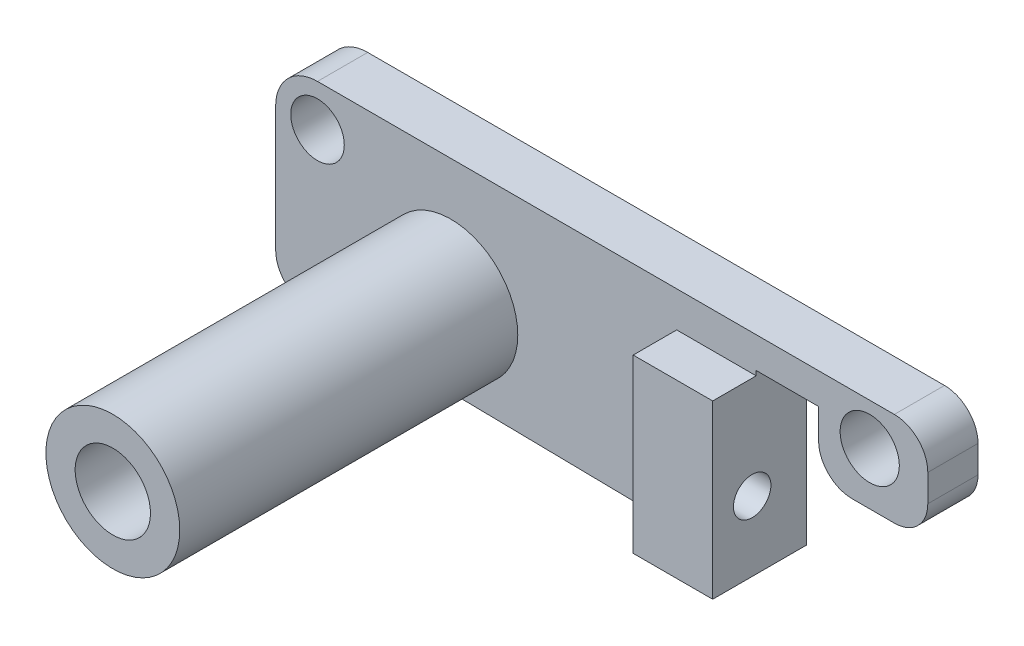
ISO-10303-21;
HEADER;
FILE_DESCRIPTION(('STEP AP214'),'2;1');
FILE_NAME('part.step','',(''),(''),'','','');
FILE_SCHEMA(('AUTOMOTIVE_DESIGN { 1 0 10303 214 1 1 1 1 }'));
ENDSEC;
DATA;
#1=APPLICATION_CONTEXT('core data for automotive mechanical design processes');
#2=APPLICATION_PROTOCOL_DEFINITION('international standard','automotive_design',2000,#1);
#3=PRODUCT_CONTEXT('',#1,'mechanical');
#4=PRODUCT('Part','Part','',(#3));
#5=PRODUCT_RELATED_PRODUCT_CATEGORY('part','',(#4));
#6=PRODUCT_DEFINITION_FORMATION('','',#4);
#7=PRODUCT_DEFINITION_CONTEXT('part definition',#1,'design');
#8=PRODUCT_DEFINITION('design','',#6,#7);
#9=PRODUCT_DEFINITION_SHAPE('','',#8);
#10=(LENGTH_UNIT() NAMED_UNIT(*) SI_UNIT(.MILLI.,.METRE.));
#11=(NAMED_UNIT(*) PLANE_ANGLE_UNIT() SI_UNIT($,.RADIAN.));
#12=(NAMED_UNIT(*) SI_UNIT($,.STERADIAN.) SOLID_ANGLE_UNIT());
#13=UNCERTAINTY_MEASURE_WITH_UNIT(LENGTH_MEASURE(1.E-05),#10,'distance_accuracy_value','');
#14=(GEOMETRIC_REPRESENTATION_CONTEXT(3) GLOBAL_UNCERTAINTY_ASSIGNED_CONTEXT((#13)) GLOBAL_UNIT_ASSIGNED_CONTEXT((#10,
#11,#12)) REPRESENTATION_CONTEXT('',''));
#15=CARTESIAN_POINT('',(0.,0.,0.));
#16=DIRECTION('',(0.,0.,1.));
#17=DIRECTION('',(1.,0.,0.));
#18=AXIS2_PLACEMENT_3D('',#15,#16,#17);
#19=CARTESIAN_POINT('',(0.,0.,3.));
#20=DIRECTION('',(0.,0.,1.));
#21=DIRECTION('',(1.,0.,0.));
#22=AXIS2_PLACEMENT_3D('',#19,#20,#21);
#23=PLANE('',#22);
#24=CARTESIAN_POINT('',(7.9679654286192,-4.64199239961162,3.));
#25=DIRECTION('',(0.,0.,1.));
#26=DIRECTION('',(1.,0.,0.));
#27=AXIS2_PLACEMENT_3D('',#24,#25,#26);
#28=CIRCLE('',#27,4.);
#29=CARTESIAN_POINT('',(11.9679654286192,-4.64199239961162,3.));
#30=VERTEX_POINT('',#29);
#31=EDGE_CURVE('E214',#30,#30,#28,.T.);
#32=ORIENTED_EDGE('',*,*,#31,.F.);
#33=EDGE_LOOP('',(#32));
#34=FACE_BOUND('',#33,.T.);
#35=CARTESIAN_POINT('',(33.,0.,3.));
#36=DIRECTION('',(0.,0.,1.));
#37=DIRECTION('',(1.,0.,0.));
#38=AXIS2_PLACEMENT_3D('',#35,#36,#37);
#39=CIRCLE('',#38,1.76931000502471);
#40=CARTESIAN_POINT('',(34.7693100050247,0.,3.));
#41=VERTEX_POINT('',#40);
#42=EDGE_CURVE('E207',#41,#41,#39,.T.);
#43=ORIENTED_EDGE('',*,*,#42,.F.);
#44=EDGE_LOOP('',(#43));
#45=FACE_BOUND('',#44,.T.);
#46=DIRECTION('',(0.,1.,0.));
#47=VECTOR('',#46,1.);
#48=CARTESIAN_POINT('',(36.4705641379497,2.5,3.));
#49=LINE('',#48,#47);
#50=CARTESIAN_POINT('',(36.4705641379497,-1.1247836523614,3.));
#51=VERTEX_POINT('',#50);
#52=CARTESIAN_POINT('',(36.4705641379497,0.5,3.));
#53=VERTEX_POINT('',#52);
#54=EDGE_CURVE('E296',#51,#53,#49,.T.);
#55=ORIENTED_EDGE('',*,*,#54,.T.);
#56=CARTESIAN_POINT('',(34.4705641379497,0.5,3.));
#57=DIRECTION('',(0.,0.,1.));
#58=DIRECTION('',(1.,0.,0.));
#59=AXIS2_PLACEMENT_3D('',#56,#57,#58);
#60=CIRCLE('',#59,2.);
#61=CARTESIAN_POINT('',(34.4705641379497,2.5,3.));
#62=VERTEX_POINT('',#61);
#63=EDGE_CURVE('E356',#53,#62,#60,.T.);
#64=ORIENTED_EDGE('',*,*,#63,.T.);
#65=DIRECTION('',(-1.,0.,0.));
#66=VECTOR('',#65,1.);
#67=CARTESIAN_POINT('',(0.,2.5,3.));
#68=LINE('',#67,#66);
#69=CARTESIAN_POINT('',(0.,2.5,3.));
#70=VERTEX_POINT('',#69);
#71=EDGE_CURVE('E298',#62,#70,#68,.T.);
#72=ORIENTED_EDGE('',*,*,#71,.T.);
#73=CARTESIAN_POINT('',(0.,0.,3.));
#74=DIRECTION('',(0.,0.,1.));
#75=DIRECTION('',(1.,0.,0.));
#76=AXIS2_PLACEMENT_3D('',#73,#74,#75);
#77=CIRCLE('',#76,2.5);
#78=CARTESIAN_POINT('',(-2.5,0.,3.));
#79=VERTEX_POINT('',#78);
#80=EDGE_CURVE('E278',#70,#79,#77,.T.);
#81=ORIENTED_EDGE('',*,*,#80,.T.);
#82=DIRECTION('',(0.,-1.,0.));
#83=VECTOR('',#82,1.);
#84=CARTESIAN_POINT('',(-2.5,-9.4475342537003,3.));
#85=LINE('',#84,#83);
#86=CARTESIAN_POINT('',(-2.5,-7.4783441678846,3.));
#87=VERTEX_POINT('',#86);
#88=EDGE_CURVE('E281',#79,#87,#85,.T.);
#89=ORIENTED_EDGE('',*,*,#88,.T.);
#90=CARTESIAN_POINT('',(-0.5,-7.4783441678846,3.));
#91=DIRECTION('',(0.,0.,1.));
#92=DIRECTION('',(1.,0.,0.));
#93=AXIS2_PLACEMENT_3D('',#90,#91,#92);
#94=CIRCLE('',#93,2.);
#95=CARTESIAN_POINT('',(-0.531047198291525,-9.47810317123432,3.));
#96=VERTEX_POINT('',#95);
#97=EDGE_CURVE('E48',#87,#96,#94,.T.);
#98=ORIENTED_EDGE('',*,*,#97,.T.);
#99=DIRECTION('',(0.999879501674858,-0.0155235991457657,0.));
#100=VECTOR('',#99,1.);
#101=CARTESIAN_POINT('',(26.2163596370604,-9.89336923199984,3.));
#102=LINE('',#101,#100);
#103=CARTESIAN_POINT('',(21.4651231541347,-9.81960405281162,3.));
#104=VERTEX_POINT('',#103);
#105=EDGE_CURVE('E284',#96,#104,#102,.T.);
#106=ORIENTED_EDGE('',*,*,#105,.T.);
#107=DIRECTION('',(0.,-1.,0.));
#108=VECTOR('',#107,1.);
#109=CARTESIAN_POINT('',(21.4651231541347,-9.89336923199984,3.));
#110=LINE('',#109,#108);
#111=CARTESIAN_POINT('',(21.4651231541347,-6.82152079733287,3.));
#112=VERTEX_POINT('',#111);
#113=EDGE_CURVE('E177',#112,#104,#110,.T.);
#114=ORIENTED_EDGE('',*,*,#113,.F.);
#115=CARTESIAN_POINT('',(21.4651231541347,-4.63670768384501,3.));
#116=VERTEX_POINT('',#115);
#117=EDGE_CURVE('E160',#116,#112,#110,.T.);
#118=ORIENTED_EDGE('',*,*,#117,.F.);
#119=CARTESIAN_POINT('',(21.4651231541347,0.370885759411058,3.));
#120=VERTEX_POINT('',#119);
#121=EDGE_CURVE('E175',#120,#116,#110,.T.);
#122=ORIENTED_EDGE('',*,*,#121,.F.);
#123=DIRECTION('',(-1.,0.,0.));
#124=VECTOR('',#123,1.);
#125=CARTESIAN_POINT('',(26.2163596370604,0.370885759411058,3.));
#126=LINE('',#125,#124);
#127=CARTESIAN_POINT('',(26.2163596370604,0.370885759411058,3.));
#128=VERTEX_POINT('',#127);
#129=EDGE_CURVE('E172',#128,#120,#126,.T.);
#130=ORIENTED_EDGE('',*,*,#129,.F.);
#131=DIRECTION('',(0.,1.,0.));
#132=VECTOR('',#131,1.);
#133=CARTESIAN_POINT('',(26.2163596370604,0.647373354610181,3.));
#134=LINE('',#133,#132);
#135=CARTESIAN_POINT('',(26.2163596370604,0.647373354610181,3.));
#136=VERTEX_POINT('',#135);
#137=EDGE_CURVE('E286',#128,#136,#134,.T.);
#138=ORIENTED_EDGE('',*,*,#137,.T.);
#139=DIRECTION('',(1.,0.,0.));
#140=VECTOR('',#139,1.);
#141=CARTESIAN_POINT('',(29.9451612737474,0.647373354610181,3.));
#142=LINE('',#141,#140);
#143=CARTESIAN_POINT('',(29.9451612737474,0.647373354610181,3.));
#144=VERTEX_POINT('',#143);
#145=EDGE_CURVE('E288',#136,#144,#142,.T.);
#146=ORIENTED_EDGE('',*,*,#145,.T.);
#147=DIRECTION('',(0.,-1.,0.));
#148=VECTOR('',#147,1.);
#149=CARTESIAN_POINT('',(29.9451612737474,-3.1247836523614,3.));
#150=LINE('',#149,#148);
#151=CARTESIAN_POINT('',(29.9451612737474,-1.1247836523614,3.));
#152=VERTEX_POINT('',#151);
#153=EDGE_CURVE('E290',#144,#152,#150,.T.);
#154=ORIENTED_EDGE('',*,*,#153,.T.);
#155=CARTESIAN_POINT('',(31.9451612737474,-1.1247836523614,3.));
#156=DIRECTION('',(0.,0.,1.));
#157=DIRECTION('',(1.,0.,0.));
#158=AXIS2_PLACEMENT_3D('',#155,#156,#157);
#159=CIRCLE('',#158,2.);
#160=CARTESIAN_POINT('',(31.9451612737474,-3.1247836523614,3.));
#161=VERTEX_POINT('',#160);
#162=EDGE_CURVE('E352',#152,#161,#159,.T.);
#163=ORIENTED_EDGE('',*,*,#162,.T.);
#164=DIRECTION('',(1.,0.,0.));
#165=VECTOR('',#164,1.);
#166=CARTESIAN_POINT('',(36.4705641379497,-3.1247836523614,3.));
#167=LINE('',#166,#165);
#168=CARTESIAN_POINT('',(34.4705641379497,-3.1247836523614,3.));
#169=VERTEX_POINT('',#168);
#170=EDGE_CURVE('E293',#161,#169,#167,.T.);
#171=ORIENTED_EDGE('',*,*,#170,.T.);
#172=CARTESIAN_POINT('',(34.4705641379497,-1.1247836523614,3.));
#173=DIRECTION('',(0.,0.,1.));
#174=DIRECTION('',(1.,0.,0.));
#175=AXIS2_PLACEMENT_3D('',#172,#173,#174);
#176=CIRCLE('',#175,2.);
#177=EDGE_CURVE('E354',#169,#51,#176,.T.);
#178=ORIENTED_EDGE('',*,*,#177,.T.);
#179=EDGE_LOOP('',(#55,#64,#72,#81,#89,#98,#106,#114,#118,#122,#130,#138,#146,#154,#163,#171,#178));
#180=FACE_BOUND('',#179,.T.);
#181=CARTESIAN_POINT('',(0.,0.,3.));
#182=DIRECTION('',(0.,0.,1.));
#183=DIRECTION('',(1.,0.,0.));
#184=AXIS2_PLACEMENT_3D('',#181,#182,#183);
#185=CIRCLE('',#184,1.6);
#186=CARTESIAN_POINT('',(1.6,0.,3.));
#187=VERTEX_POINT('',#186);
#188=EDGE_CURVE('E270',#187,#187,#185,.T.);
#189=ORIENTED_EDGE('',*,*,#188,.F.);
#190=EDGE_LOOP('',(#189));
#191=FACE_BOUND('',#190,.T.);
#192=ADVANCED_FACE('F33',(#34,#45,#180,#191),#23,.T.);
#193=CARTESIAN_POINT('',(0.,0.,0.));
#194=DIRECTION('',(0.,0.,1.));
#195=DIRECTION('',(1.,0.,0.));
#196=AXIS2_PLACEMENT_3D('',#193,#194,#195);
#197=PLANE('',#196);
#198=CARTESIAN_POINT('',(33.,0.,0.));
#199=DIRECTION('',(0.,0.,-1.));
#200=DIRECTION('',(-1.,0.,0.));
#201=AXIS2_PLACEMENT_3D('',#198,#199,#200);
#202=CIRCLE('',#201,1.76931000502471);
#203=CARTESIAN_POINT('',(31.2306899949753,0.,0.));
#204=VERTEX_POINT('',#203);
#205=EDGE_CURVE('E210',#204,#204,#202,.T.);
#206=ORIENTED_EDGE('',*,*,#205,.F.);
#207=EDGE_LOOP('',(#206));
#208=FACE_BOUND('',#207,.T.);
#209=DIRECTION('',(-1.,0.,0.));
#210=VECTOR('',#209,1.);
#211=CARTESIAN_POINT('',(0.,2.5,0.));
#212=LINE('',#211,#210);
#213=CARTESIAN_POINT('',(34.4705641379497,2.5,0.));
#214=VERTEX_POINT('',#213);
#215=CARTESIAN_POINT('',(0.,2.5,0.));
#216=VERTEX_POINT('',#215);
#217=EDGE_CURVE('E265',#214,#216,#212,.T.);
#218=ORIENTED_EDGE('',*,*,#217,.F.);
#219=CARTESIAN_POINT('',(34.4705641379497,0.5,0.));
#220=DIRECTION('',(0.,0.,1.));
#221=DIRECTION('',(1.,0.,0.));
#222=AXIS2_PLACEMENT_3D('',#219,#220,#221);
#223=CIRCLE('',#222,2.);
#224=CARTESIAN_POINT('',(36.4705641379497,0.5,0.));
#225=VERTEX_POINT('',#224);
#226=EDGE_CURVE('E344',#214,#225,#223,.F.);
#227=ORIENTED_EDGE('',*,*,#226,.T.);
#228=DIRECTION('',(0.,1.,0.));
#229=VECTOR('',#228,1.);
#230=CARTESIAN_POINT('',(36.4705641379497,2.5,0.));
#231=LINE('',#230,#229);
#232=CARTESIAN_POINT('',(36.4705641379497,-1.1247836523614,0.));
#233=VERTEX_POINT('',#232);
#234=EDGE_CURVE('E317',#233,#225,#231,.T.);
#235=ORIENTED_EDGE('',*,*,#234,.F.);
#236=CARTESIAN_POINT('',(34.4705641379497,-1.1247836523614,0.));
#237=DIRECTION('',(0.,0.,1.));
#238=DIRECTION('',(1.,0.,0.));
#239=AXIS2_PLACEMENT_3D('',#236,#237,#238);
#240=CIRCLE('',#239,2.);
#241=CARTESIAN_POINT('',(34.4705641379497,-3.1247836523614,0.));
#242=VERTEX_POINT('',#241);
#243=EDGE_CURVE('E342',#233,#242,#240,.F.);
#244=ORIENTED_EDGE('',*,*,#243,.T.);
#245=DIRECTION('',(1.,0.,0.));
#246=VECTOR('',#245,1.);
#247=CARTESIAN_POINT('',(36.4705641379497,-3.1247836523614,0.));
#248=LINE('',#247,#246);
#249=CARTESIAN_POINT('',(31.9451612737474,-3.1247836523614,0.));
#250=VERTEX_POINT('',#249);
#251=EDGE_CURVE('E314',#250,#242,#248,.T.);
#252=ORIENTED_EDGE('',*,*,#251,.F.);
#253=CARTESIAN_POINT('',(31.9451612737474,-1.1247836523614,0.));
#254=DIRECTION('',(0.,0.,1.));
#255=DIRECTION('',(1.,0.,0.));
#256=AXIS2_PLACEMENT_3D('',#253,#254,#255);
#257=CIRCLE('',#256,2.);
#258=CARTESIAN_POINT('',(29.9451612737474,-1.1247836523614,0.));
#259=VERTEX_POINT('',#258);
#260=EDGE_CURVE('E340',#250,#259,#257,.F.);
#261=ORIENTED_EDGE('',*,*,#260,.T.);
#262=DIRECTION('',(0.,-1.,0.));
#263=VECTOR('',#262,1.);
#264=CARTESIAN_POINT('',(29.9451612737474,-3.1247836523614,0.));
#265=LINE('',#264,#263);
#266=CARTESIAN_POINT('',(29.9451612737474,0.647373354610181,0.));
#267=VERTEX_POINT('',#266);
#268=EDGE_CURVE('E311',#267,#259,#265,.T.);
#269=ORIENTED_EDGE('',*,*,#268,.F.);
#270=DIRECTION('',(1.,0.,0.));
#271=VECTOR('',#270,1.);
#272=CARTESIAN_POINT('',(29.9451612737474,0.647373354610181,0.));
#273=LINE('',#272,#271);
#274=CARTESIAN_POINT('',(26.2163596370604,0.647373354610181,0.));
#275=VERTEX_POINT('',#274);
#276=EDGE_CURVE('E309',#275,#267,#273,.T.);
#277=ORIENTED_EDGE('',*,*,#276,.F.);
#278=DIRECTION('',(0.,1.,0.));
#279=VECTOR('',#278,1.);
#280=CARTESIAN_POINT('',(26.2163596370604,0.647373354610181,0.));
#281=LINE('',#280,#279);
#282=CARTESIAN_POINT('',(26.2163596370604,-9.89336923199984,0.));
#283=VERTEX_POINT('',#282);
#284=EDGE_CURVE('E307',#283,#275,#281,.T.);
#285=ORIENTED_EDGE('',*,*,#284,.F.);
#286=DIRECTION('',(0.999879501674858,-0.0155235991457657,0.));
#287=VECTOR('',#286,1.);
#288=CARTESIAN_POINT('',(26.2163596370604,-9.89336923199984,0.));
#289=LINE('',#288,#287);
#290=CARTESIAN_POINT('',(-0.531047198291525,-9.47810317123432,0.));
#291=VERTEX_POINT('',#290);
#292=EDGE_CURVE('E305',#291,#283,#289,.T.);
#293=ORIENTED_EDGE('',*,*,#292,.F.);
#294=CARTESIAN_POINT('',(-0.5,-7.4783441678846,0.));
#295=DIRECTION('',(0.,0.,1.));
#296=DIRECTION('',(1.,0.,0.));
#297=AXIS2_PLACEMENT_3D('',#294,#295,#296);
#298=CIRCLE('',#297,2.);
#299=CARTESIAN_POINT('',(-2.5,-7.4783441678846,0.));
#300=VERTEX_POINT('',#299);
#301=EDGE_CURVE('E338',#291,#300,#298,.F.);
#302=ORIENTED_EDGE('',*,*,#301,.T.);
#303=DIRECTION('',(0.,-1.,0.));
#304=VECTOR('',#303,1.);
#305=CARTESIAN_POINT('',(-2.5,-9.4475342537003,0.));
#306=LINE('',#305,#304);
#307=CARTESIAN_POINT('',(-2.5,0.,0.));
#308=VERTEX_POINT('',#307);
#309=EDGE_CURVE('E303',#308,#300,#306,.T.);
#310=ORIENTED_EDGE('',*,*,#309,.F.);
#311=CARTESIAN_POINT('',(0.,0.,0.));
#312=DIRECTION('',(0.,0.,1.));
#313=DIRECTION('',(1.,0.,0.));
#314=AXIS2_PLACEMENT_3D('',#311,#312,#313);
#315=CIRCLE('',#314,2.5);
#316=EDGE_CURVE('E274',#216,#308,#315,.T.);
#317=ORIENTED_EDGE('',*,*,#316,.F.);
#318=EDGE_LOOP('',(#218,#227,#235,#244,#252,#261,#269,#277,#285,#293,#302,#310,#317));
#319=FACE_BOUND('',#318,.T.);
#320=CARTESIAN_POINT('',(0.,0.,0.));
#321=DIRECTION('',(0.,0.,1.));
#322=DIRECTION('',(1.,0.,0.));
#323=AXIS2_PLACEMENT_3D('',#320,#321,#322);
#324=CIRCLE('',#323,1.6);
#325=CARTESIAN_POINT('',(1.6,0.,0.));
#326=VERTEX_POINT('',#325);
#327=EDGE_CURVE('E268',#326,#326,#324,.T.);
#328=ORIENTED_EDGE('',*,*,#327,.T.);
#329=EDGE_LOOP('',(#328));
#330=FACE_BOUND('',#329,.T.);
#331=ADVANCED_FACE('F249',(#208,#319,#330),#197,.F.);
#332=CARTESIAN_POINT('',(0.,0.,3.));
#333=DIRECTION('',(0.,0.,-1.));
#334=DIRECTION('',(-1.,0.,0.));
#335=AXIS2_PLACEMENT_3D('',#332,#333,#334);
#336=CYLINDRICAL_SURFACE('',#335,2.5);
#337=ORIENTED_EDGE('',*,*,#316,.T.);
#338=DIRECTION('',(0.,0.,-1.));
#339=VECTOR('',#338,1.);
#340=CARTESIAN_POINT('',(-2.5,0.,3.));
#341=LINE('',#340,#339);
#342=EDGE_CURVE('E332',#79,#308,#341,.T.);
#343=ORIENTED_EDGE('',*,*,#342,.F.);
#344=ORIENTED_EDGE('',*,*,#80,.F.);
#345=DIRECTION('',(0.,0.,-1.));
#346=VECTOR('',#345,1.);
#347=CARTESIAN_POINT('',(0.,2.5,3.));
#348=LINE('',#347,#346);
#349=EDGE_CURVE('E300',#70,#216,#348,.T.);
#350=ORIENTED_EDGE('',*,*,#349,.T.);
#351=EDGE_LOOP('',(#337,#343,#344,#350));
#352=FACE_BOUND('',#351,.T.);
#353=ADVANCED_FACE('F260',(#352),#336,.T.);
#354=CARTESIAN_POINT('',(-2.5,-9.4475342537003,3.));
#355=DIRECTION('',(1.,0.,0.));
#356=DIRECTION('',(0.,0.,-1.));
#357=AXIS2_PLACEMENT_3D('',#354,#355,#356);
#358=PLANE('',#357);
#359=ORIENTED_EDGE('',*,*,#309,.T.);
#360=DIRECTION('',(0.,0.,-1.));
#361=VECTOR('',#360,1.);
#362=CARTESIAN_POINT('',(-2.5,-7.4783441678846,3.));
#363=LINE('',#362,#361);
#364=EDGE_CURVE('E11',#300,#87,#363,.F.);
#365=ORIENTED_EDGE('',*,*,#364,.T.);
#366=ORIENTED_EDGE('',*,*,#88,.F.);
#367=ORIENTED_EDGE('',*,*,#342,.T.);
#368=EDGE_LOOP('',(#359,#365,#366,#367));
#369=FACE_BOUND('',#368,.T.);
#370=ADVANCED_FACE('F442',(#369),#358,.F.);
#371=CARTESIAN_POINT('',(26.2163596370604,-9.89336923199984,3.));
#372=DIRECTION('',(0.0155235991457657,0.999879501674858,0.));
#373=DIRECTION('',(-0.999879501674858,0.0155235991457657,0.));
#374=AXIS2_PLACEMENT_3D('',#371,#372,#373);
#375=PLANE('',#374);
#376=ORIENTED_EDGE('',*,*,#105,.F.);
#377=DIRECTION('',(0.,0.,-1.));
#378=VECTOR('',#377,1.);
#379=CARTESIAN_POINT('',(-0.531047198291532,-9.47810317123432,3.));
#380=LINE('',#379,#378);
#381=EDGE_CURVE('E41',#96,#291,#380,.T.);
#382=ORIENTED_EDGE('',*,*,#381,.T.);
#383=ORIENTED_EDGE('',*,*,#292,.T.);
#384=DIRECTION('',(0.,0.,-1.));
#385=VECTOR('',#384,1.);
#386=CARTESIAN_POINT('',(26.2163596370604,-9.89336923199984,3.));
#387=LINE('',#386,#385);
#388=CARTESIAN_POINT('',(26.2163596370604,-9.89336923199984,3.));
#389=VERTEX_POINT('',#388);
#390=EDGE_CURVE('E329',#389,#283,#387,.T.);
#391=ORIENTED_EDGE('',*,*,#390,.F.);
#392=EDGE_CURVE('E283',#104,#389,#102,.T.);
#393=ORIENTED_EDGE('',*,*,#392,.F.);
#394=EDGE_LOOP('',(#376,#382,#383,#391,#393));
#395=FACE_BOUND('',#394,.T.);
#396=ADVANCED_FACE('F368',(#395),#375,.F.);
#397=CARTESIAN_POINT('',(26.2163596370604,0.647373354610181,3.));
#398=DIRECTION('',(-1.,0.,0.));
#399=DIRECTION('',(0.,0.,1.));
#400=AXIS2_PLACEMENT_3D('',#397,#398,#399);
#401=PLANE('',#400);
#402=CARTESIAN_POINT('',(26.2163596370604,-5.72911424058894,3.24117304498722));
#403=DIRECTION('',(1.,0.,0.));
#404=DIRECTION('',(0.,0.,-1.));
#405=AXIS2_PLACEMENT_3D('',#402,#403,#404);
#406=CIRCLE('',#405,1.11871199280491);
#407=CARTESIAN_POINT('',(26.2163596370604,-5.72911424058894,2.1224610521823));
#408=VERTEX_POINT('',#407);
#409=EDGE_CURVE('E164',#408,#408,#406,.T.);
#410=ORIENTED_EDGE('',*,*,#409,.F.);
#411=EDGE_LOOP('',(#410));
#412=FACE_BOUND('',#411,.T.);
#413=ORIENTED_EDGE('',*,*,#284,.T.);
#414=DIRECTION('',(0.,0.,-1.));
#415=VECTOR('',#414,1.);
#416=CARTESIAN_POINT('',(26.2163596370604,0.647373354610181,3.));
#417=LINE('',#416,#415);
#418=EDGE_CURVE('E326',#136,#275,#417,.T.);
#419=ORIENTED_EDGE('',*,*,#418,.F.);
#420=ORIENTED_EDGE('',*,*,#137,.F.);
#421=DIRECTION('',(0.,0.,-1.));
#422=VECTOR('',#421,1.);
#423=CARTESIAN_POINT('',(26.2163596370604,0.370885759411058,5.6));
#424=LINE('',#423,#422);
#425=CARTESIAN_POINT('',(26.2163596370604,0.370885759411058,5.6));
#426=VERTEX_POINT('',#425);
#427=EDGE_CURVE('E271',#426,#128,#424,.T.);
#428=ORIENTED_EDGE('',*,*,#427,.F.);
#429=DIRECTION('',(0.,1.,0.));
#430=VECTOR('',#429,1.);
#431=CARTESIAN_POINT('',(26.2163596370604,-9.89336923199984,5.6));
#432=LINE('',#431,#430);
#433=CARTESIAN_POINT('',(26.2163596370604,-9.89336923199984,5.6));
#434=VERTEX_POINT('',#433);
#435=EDGE_CURVE('E187',#434,#426,#432,.T.);
#436=ORIENTED_EDGE('',*,*,#435,.F.);
#437=DIRECTION('',(0.,0.,-1.));
#438=VECTOR('',#437,1.);
#439=CARTESIAN_POINT('',(26.2163596370604,-9.89336923199984,5.6));
#440=LINE('',#439,#438);
#441=EDGE_CURVE('E198',#434,#389,#440,.T.);
#442=ORIENTED_EDGE('',*,*,#441,.T.);
#443=ORIENTED_EDGE('',*,*,#390,.T.);
#444=EDGE_LOOP('',(#413,#419,#420,#428,#436,#442,#443));
#445=FACE_BOUND('',#444,.T.);
#446=ADVANCED_FACE('F376',(#412,#445),#401,.F.);
#447=CARTESIAN_POINT('',(29.9451612737474,0.647373354610181,3.));
#448=DIRECTION('',(0.,1.,0.));
#449=DIRECTION('',(0.,0.,1.));
#450=AXIS2_PLACEMENT_3D('',#447,#448,#449);
#451=PLANE('',#450);
#452=ORIENTED_EDGE('',*,*,#276,.T.);
#453=DIRECTION('',(0.,0.,-1.));
#454=VECTOR('',#453,1.);
#455=CARTESIAN_POINT('',(29.9451612737474,0.647373354610181,3.));
#456=LINE('',#455,#454);
#457=EDGE_CURVE('E323',#144,#267,#456,.T.);
#458=ORIENTED_EDGE('',*,*,#457,.F.);
#459=ORIENTED_EDGE('',*,*,#145,.F.);
#460=ORIENTED_EDGE('',*,*,#418,.T.);
#461=EDGE_LOOP('',(#452,#458,#459,#460));
#462=FACE_BOUND('',#461,.T.);
#463=ADVANCED_FACE('F381',(#462),#451,.F.);
#464=CARTESIAN_POINT('',(29.9451612737474,-3.1247836523614,3.));
#465=DIRECTION('',(1.,0.,0.));
#466=DIRECTION('',(0.,0.,-1.));
#467=AXIS2_PLACEMENT_3D('',#464,#465,#466);
#468=PLANE('',#467);
#469=ORIENTED_EDGE('',*,*,#268,.T.);
#470=DIRECTION('',(0.,0.,-1.));
#471=VECTOR('',#470,1.);
#472=CARTESIAN_POINT('',(29.9451612737474,-1.1247836523614,3.));
#473=LINE('',#472,#471);
#474=EDGE_CURVE('E363',#259,#152,#473,.F.);
#475=ORIENTED_EDGE('',*,*,#474,.T.);
#476=ORIENTED_EDGE('',*,*,#153,.F.);
#477=ORIENTED_EDGE('',*,*,#457,.T.);
#478=EDGE_LOOP('',(#469,#475,#476,#477));
#479=FACE_BOUND('',#478,.T.);
#480=ADVANCED_FACE('F430',(#479),#468,.F.);
#481=CARTESIAN_POINT('',(36.4705641379497,-3.1247836523614,3.));
#482=DIRECTION('',(0.,1.,0.));
#483=DIRECTION('',(0.,0.,1.));
#484=AXIS2_PLACEMENT_3D('',#481,#482,#483);
#485=PLANE('',#484);
#486=ORIENTED_EDGE('',*,*,#251,.T.);
#487=DIRECTION('',(0.,0.,-1.));
#488=VECTOR('',#487,1.);
#489=CARTESIAN_POINT('',(34.4705641379497,-3.1247836523614,3.));
#490=LINE('',#489,#488);
#491=EDGE_CURVE('E361',#242,#169,#490,.F.);
#492=ORIENTED_EDGE('',*,*,#491,.T.);
#493=ORIENTED_EDGE('',*,*,#170,.F.);
#494=DIRECTION('',(0.,0.,-1.));
#495=VECTOR('',#494,1.);
#496=CARTESIAN_POINT('',(31.9451612737474,-3.1247836523614,3.));
#497=LINE('',#496,#495);
#498=EDGE_CURVE('E358',#161,#250,#497,.T.);
#499=ORIENTED_EDGE('',*,*,#498,.T.);
#500=EDGE_LOOP('',(#486,#492,#493,#499));
#501=FACE_BOUND('',#500,.T.);
#502=ADVANCED_FACE('F426',(#501),#485,.F.);
#503=CARTESIAN_POINT('',(36.4705641379497,2.5,3.));
#504=DIRECTION('',(-1.,0.,0.));
#505=DIRECTION('',(0.,0.,1.));
#506=AXIS2_PLACEMENT_3D('',#503,#504,#505);
#507=PLANE('',#506);
#508=ORIENTED_EDGE('',*,*,#234,.T.);
#509=DIRECTION('',(0.,0.,-1.));
#510=VECTOR('',#509,1.);
#511=CARTESIAN_POINT('',(36.4705641379497,0.5,3.));
#512=LINE('',#511,#510);
#513=EDGE_CURVE('E349',#225,#53,#512,.F.);
#514=ORIENTED_EDGE('',*,*,#513,.T.);
#515=ORIENTED_EDGE('',*,*,#54,.F.);
#516=DIRECTION('',(0.,0.,-1.));
#517=VECTOR('',#516,1.);
#518=CARTESIAN_POINT('',(36.4705641379497,-1.1247836523614,3.));
#519=LINE('',#518,#517);
#520=EDGE_CURVE('E346',#51,#233,#519,.T.);
#521=ORIENTED_EDGE('',*,*,#520,.T.);
#522=EDGE_LOOP('',(#508,#514,#515,#521));
#523=FACE_BOUND('',#522,.T.);
#524=ADVANCED_FACE('F422',(#523),#507,.F.);
#525=CARTESIAN_POINT('',(0.,2.5,3.));
#526=DIRECTION('',(0.,-1.,0.));
#527=DIRECTION('',(0.,0.,-1.));
#528=AXIS2_PLACEMENT_3D('',#525,#526,#527);
#529=PLANE('',#528);
#530=ORIENTED_EDGE('',*,*,#71,.F.);
#531=DIRECTION('',(0.,0.,-1.));
#532=VECTOR('',#531,1.);
#533=CARTESIAN_POINT('',(34.4705641379497,2.5,3.));
#534=LINE('',#533,#532);
#535=EDGE_CURVE('E335',#62,#214,#534,.T.);
#536=ORIENTED_EDGE('',*,*,#535,.T.);
#537=ORIENTED_EDGE('',*,*,#217,.T.);
#538=ORIENTED_EDGE('',*,*,#349,.F.);
#539=EDGE_LOOP('',(#530,#536,#537,#538));
#540=FACE_BOUND('',#539,.T.);
#541=ADVANCED_FACE('F410',(#540),#529,.F.);
#542=CARTESIAN_POINT('',(0.,0.,3.));
#543=DIRECTION('',(0.,0.,-1.));
#544=DIRECTION('',(-1.,0.,0.));
#545=AXIS2_PLACEMENT_3D('',#542,#543,#544);
#546=CYLINDRICAL_SURFACE('',#545,1.6);
#547=ORIENTED_EDGE('',*,*,#188,.T.);
#548=EDGE_LOOP('',(#547));
#549=FACE_BOUND('',#548,.T.);
#550=ORIENTED_EDGE('',*,*,#327,.F.);
#551=EDGE_LOOP('',(#550));
#552=FACE_BOUND('',#551,.T.);
#553=ADVANCED_FACE('F403',(#549,#552),#546,.F.);
#554=CARTESIAN_POINT('',(0.,0.,3.));
#555=DIRECTION('',(0.,0.,1.));
#556=DIRECTION('',(1.,0.,0.));
#557=AXIS2_PLACEMENT_3D('',#554,#555,#556);
#558=PLANE('',#557);
#559=CARTESIAN_POINT('',(21.4651231541347,-9.89336923199984,3.));
#560=VERTEX_POINT('',#559);
#561=EDGE_CURVE('E179',#104,#560,#110,.T.);
#562=ORIENTED_EDGE('',*,*,#561,.F.);
#563=ORIENTED_EDGE('',*,*,#392,.T.);
#564=DIRECTION('',(1.,0.,0.));
#565=VECTOR('',#564,1.);
#566=CARTESIAN_POINT('',(26.2163596370604,-9.89336923199984,3.));
#567=LINE('',#566,#565);
#568=EDGE_CURVE('E185',#560,#389,#567,.T.);
#569=ORIENTED_EDGE('',*,*,#568,.F.);
#570=EDGE_LOOP('',(#562,#563,#569));
#571=FACE_BOUND('',#570,.T.);
#572=ADVANCED_FACE('F401',(#571),#558,.F.);
#573=CARTESIAN_POINT('',(26.2163596370604,0.370885759411058,5.6));
#574=DIRECTION('',(0.,-1.,0.));
#575=DIRECTION('',(0.,0.,-1.));
#576=AXIS2_PLACEMENT_3D('',#573,#574,#575);
#577=PLANE('',#576);
#578=ORIENTED_EDGE('',*,*,#129,.T.);
#579=DIRECTION('',(0.,0.,-1.));
#580=VECTOR('',#579,1.);
#581=CARTESIAN_POINT('',(21.4651231541347,0.370885759411058,5.6));
#582=LINE('',#581,#580);
#583=CARTESIAN_POINT('',(21.4651231541347,0.370885759411058,5.6));
#584=VERTEX_POINT('',#583);
#585=EDGE_CURVE('E184',#584,#120,#582,.T.);
#586=ORIENTED_EDGE('',*,*,#585,.F.);
#587=DIRECTION('',(-1.,0.,0.));
#588=VECTOR('',#587,1.);
#589=CARTESIAN_POINT('',(26.2163596370604,0.370885759411058,5.6));
#590=LINE('',#589,#588);
#591=EDGE_CURVE('E201',#426,#584,#590,.T.);
#592=ORIENTED_EDGE('',*,*,#591,.F.);
#593=ORIENTED_EDGE('',*,*,#427,.T.);
#594=EDGE_LOOP('',(#578,#586,#592,#593));
#595=FACE_BOUND('',#594,.T.);
#596=ADVANCED_FACE('F387',(#595),#577,.F.);
#597=CARTESIAN_POINT('',(21.4651231541347,-9.89336923199984,5.6));
#598=DIRECTION('',(1.,0.,0.));
#599=DIRECTION('',(0.,0.,-1.));
#600=AXIS2_PLACEMENT_3D('',#597,#598,#599);
#601=PLANE('',#600);
#602=ORIENTED_EDGE('',*,*,#121,.T.);
#603=CARTESIAN_POINT('',(21.4651231541347,-5.72911424058894,3.24117304498722));
#604=DIRECTION('',(1.,0.,0.));
#605=DIRECTION('',(0.,0.,-1.));
#606=AXIS2_PLACEMENT_3D('',#603,#604,#605);
#607=CIRCLE('',#606,1.11871199280491);
#608=EDGE_CURVE('E163',#112,#116,#607,.F.);
#609=ORIENTED_EDGE('',*,*,#608,.F.);
#610=ORIENTED_EDGE('',*,*,#113,.T.);
#611=ORIENTED_EDGE('',*,*,#561,.T.);
#612=DIRECTION('',(0.,0.,-1.));
#613=VECTOR('',#612,1.);
#614=CARTESIAN_POINT('',(21.4651231541347,-9.89336923199984,5.6));
#615=LINE('',#614,#613);
#616=CARTESIAN_POINT('',(21.4651231541347,-9.89336923199984,5.6));
#617=VERTEX_POINT('',#616);
#618=EDGE_CURVE('E393',#617,#560,#615,.T.);
#619=ORIENTED_EDGE('',*,*,#618,.F.);
#620=DIRECTION('',(0.,-1.,0.));
#621=VECTOR('',#620,1.);
#622=CARTESIAN_POINT('',(21.4651231541347,-9.89336923199984,5.6));
#623=LINE('',#622,#621);
#624=EDGE_CURVE('E199',#584,#617,#623,.T.);
#625=ORIENTED_EDGE('',*,*,#624,.F.);
#626=ORIENTED_EDGE('',*,*,#585,.T.);
#627=EDGE_LOOP('',(#602,#609,#610,#611,#619,#625,#626));
#628=FACE_BOUND('',#627,.T.);
#629=ADVANCED_FACE('F181',(#628),#601,.F.);
#630=CARTESIAN_POINT('',(26.2163596370604,-9.89336923199984,5.6));
#631=DIRECTION('',(0.,1.,0.));
#632=DIRECTION('',(0.,0.,1.));
#633=AXIS2_PLACEMENT_3D('',#630,#631,#632);
#634=PLANE('',#633);
#635=ORIENTED_EDGE('',*,*,#568,.T.);
#636=ORIENTED_EDGE('',*,*,#441,.F.);
#637=DIRECTION('',(1.,0.,0.));
#638=VECTOR('',#637,1.);
#639=CARTESIAN_POINT('',(26.2163596370604,-9.89336923199984,5.6));
#640=LINE('',#639,#638);
#641=EDGE_CURVE('E196',#617,#434,#640,.T.);
#642=ORIENTED_EDGE('',*,*,#641,.F.);
#643=ORIENTED_EDGE('',*,*,#618,.T.);
#644=EDGE_LOOP('',(#635,#636,#642,#643));
#645=FACE_BOUND('',#644,.T.);
#646=ADVANCED_FACE('F398',(#645),#634,.F.);
#647=CARTESIAN_POINT('',(0.,0.,5.6));
#648=DIRECTION('',(0.,0.,1.));
#649=DIRECTION('',(1.,0.,0.));
#650=AXIS2_PLACEMENT_3D('',#647,#648,#649);
#651=PLANE('',#650);
#652=ORIENTED_EDGE('',*,*,#435,.T.);
#653=ORIENTED_EDGE('',*,*,#591,.T.);
#654=ORIENTED_EDGE('',*,*,#624,.T.);
#655=ORIENTED_EDGE('',*,*,#641,.T.);
#656=EDGE_LOOP('',(#652,#653,#654,#655));
#657=FACE_BOUND('',#656,.T.);
#658=ADVANCED_FACE('F389',(#657),#651,.T.);
#659=CARTESIAN_POINT('',(18.3009278089064,-5.72911424058894,3.24117304498722));
#660=DIRECTION('',(1.,0.,0.));
#661=DIRECTION('',(0.,0.,-1.));
#662=AXIS2_PLACEMENT_3D('',#659,#660,#661);
#663=CYLINDRICAL_SURFACE('',#662,1.11871199280491);
#664=ORIENTED_EDGE('',*,*,#608,.T.);
#665=EDGE_CURVE('E156',#116,#112,#607,.F.);
#666=ORIENTED_EDGE('',*,*,#665,.T.);
#667=EDGE_LOOP('',(#664,#666));
#668=FACE_BOUND('',#667,.T.);
#669=ORIENTED_EDGE('',*,*,#409,.T.);
#670=EDGE_LOOP('',(#669));
#671=FACE_BOUND('',#670,.T.);
#672=ADVANCED_FACE('F166',(#668,#671),#663,.F.);
#673=CARTESIAN_POINT('',(21.4651231541347,-9.89336923199984,5.6));
#674=DIRECTION('',(1.,0.,0.));
#675=DIRECTION('',(0.,0.,-1.));
#676=AXIS2_PLACEMENT_3D('',#673,#674,#675);
#677=PLANE('',#676);
#678=ORIENTED_EDGE('',*,*,#665,.F.);
#679=ORIENTED_EDGE('',*,*,#117,.T.);
#680=EDGE_LOOP('',(#678,#679));
#681=FACE_BOUND('',#680,.T.);
#682=ADVANCED_FACE('F158',(#681),#677,.T.);
#683=CARTESIAN_POINT('',(33.,0.,5.));
#684=DIRECTION('',(0.,0.,-1.));
#685=DIRECTION('',(-1.,0.,0.));
#686=AXIS2_PLACEMENT_3D('',#683,#684,#685);
#687=CYLINDRICAL_SURFACE('',#686,1.76931000502471);
#688=ORIENTED_EDGE('',*,*,#42,.T.);
#689=EDGE_LOOP('',(#688));
#690=FACE_BOUND('',#689,.T.);
#691=ORIENTED_EDGE('',*,*,#205,.T.);
#692=EDGE_LOOP('',(#691));
#693=FACE_BOUND('',#692,.T.);
#694=ADVANCED_FACE('F243',(#690,#693),#687,.F.);
#695=CARTESIAN_POINT('',(7.9679654286192,-4.64199239961162,23.2));
#696=DIRECTION('',(0.,0.,-1.));
#697=DIRECTION('',(-1.,0.,0.));
#698=AXIS2_PLACEMENT_3D('',#695,#696,#697);
#699=CYLINDRICAL_SURFACE('',#698,4.);
#700=CARTESIAN_POINT('',(7.9679654286192,-4.64199239961162,23.2));
#701=DIRECTION('',(0.,0.,1.));
#702=DIRECTION('',(1.,0.,0.));
#703=AXIS2_PLACEMENT_3D('',#700,#701,#702);
#704=CIRCLE('',#703,4.);
#705=CARTESIAN_POINT('',(11.9679654286192,-4.64199239961162,23.2));
#706=VERTEX_POINT('',#705);
#707=EDGE_CURVE('E213',#706,#706,#704,.T.);
#708=ORIENTED_EDGE('',*,*,#707,.F.);
#709=EDGE_LOOP('',(#708));
#710=FACE_BOUND('',#709,.T.);
#711=ORIENTED_EDGE('',*,*,#31,.T.);
#712=EDGE_LOOP('',(#711));
#713=FACE_BOUND('',#712,.T.);
#714=ADVANCED_FACE('F237',(#710,#713),#699,.T.);
#715=CARTESIAN_POINT('',(7.9679654286192,-4.64199239961162,23.2));
#716=DIRECTION('',(0.,0.,1.));
#717=DIRECTION('',(1.,0.,0.));
#718=AXIS2_PLACEMENT_3D('',#715,#716,#717);
#719=PLANE('',#718);
#720=CARTESIAN_POINT('',(7.9679654286192,-4.64199239961162,23.2));
#721=DIRECTION('',(0.,0.,1.));
#722=DIRECTION('',(1.,0.,0.));
#723=AXIS2_PLACEMENT_3D('',#720,#721,#722);
#724=CIRCLE('',#723,2.25);
#725=CARTESIAN_POINT('',(10.2179654286192,-4.64199239961162,23.2));
#726=VERTEX_POINT('',#725);
#727=EDGE_CURVE('E220',#726,#726,#724,.T.);
#728=ORIENTED_EDGE('',*,*,#727,.F.);
#729=EDGE_LOOP('',(#728));
#730=FACE_BOUND('',#729,.T.);
#731=ORIENTED_EDGE('',*,*,#707,.T.);
#732=EDGE_LOOP('',(#731));
#733=FACE_BOUND('',#732,.T.);
#734=ADVANCED_FACE('F231',(#730,#733),#719,.T.);
#735=CARTESIAN_POINT('',(7.9679654286192,-4.64199239961162,15.2));
#736=DIRECTION('',(0.,0.,1.));
#737=DIRECTION('',(1.,0.,0.));
#738=AXIS2_PLACEMENT_3D('',#735,#736,#737);
#739=CYLINDRICAL_SURFACE('',#738,2.25);
#740=CARTESIAN_POINT('',(7.9679654286192,-4.64199239961162,15.2));
#741=DIRECTION('',(0.,0.,1.));
#742=DIRECTION('',(1.,0.,0.));
#743=AXIS2_PLACEMENT_3D('',#740,#741,#742);
#744=CIRCLE('',#743,2.25);
#745=CARTESIAN_POINT('',(10.2179654286192,-4.64199239961162,15.2));
#746=VERTEX_POINT('',#745);
#747=EDGE_CURVE('E217',#746,#746,#744,.T.);
#748=ORIENTED_EDGE('',*,*,#747,.F.);
#749=EDGE_LOOP('',(#748));
#750=FACE_BOUND('',#749,.T.);
#751=ORIENTED_EDGE('',*,*,#727,.T.);
#752=EDGE_LOOP('',(#751));
#753=FACE_BOUND('',#752,.T.);
#754=ADVANCED_FACE('F228',(#750,#753),#739,.F.);
#755=CARTESIAN_POINT('',(7.9679654286192,-4.64199239961162,15.2));
#756=DIRECTION('',(0.,0.,1.));
#757=DIRECTION('',(1.,0.,0.));
#758=AXIS2_PLACEMENT_3D('',#755,#756,#757);
#759=PLANE('',#758);
#760=ORIENTED_EDGE('',*,*,#747,.T.);
#761=EDGE_LOOP('',(#760));
#762=FACE_BOUND('',#761,.T.);
#763=ADVANCED_FACE('F226',(#762),#759,.T.);
#764=CARTESIAN_POINT('',(34.4705641379497,0.5,3.));
#765=DIRECTION('',(0.,0.,-1.));
#766=DIRECTION('',(-1.,0.,0.));
#767=AXIS2_PLACEMENT_3D('',#764,#765,#766);
#768=CYLINDRICAL_SURFACE('',#767,2.);
#769=ORIENTED_EDGE('',*,*,#63,.F.);
#770=ORIENTED_EDGE('',*,*,#513,.F.);
#771=ORIENTED_EDGE('',*,*,#226,.F.);
#772=ORIENTED_EDGE('',*,*,#535,.F.);
#773=EDGE_LOOP('',(#769,#770,#771,#772));
#774=FACE_BOUND('',#773,.T.);
#775=ADVANCED_FACE('F448',(#774),#768,.T.);
#776=CARTESIAN_POINT('',(34.4705641379497,-1.1247836523614,3.));
#777=DIRECTION('',(0.,0.,-1.));
#778=DIRECTION('',(-1.,0.,0.));
#779=AXIS2_PLACEMENT_3D('',#776,#777,#778);
#780=CYLINDRICAL_SURFACE('',#779,2.);
#781=ORIENTED_EDGE('',*,*,#177,.F.);
#782=ORIENTED_EDGE('',*,*,#491,.F.);
#783=ORIENTED_EDGE('',*,*,#243,.F.);
#784=ORIENTED_EDGE('',*,*,#520,.F.);
#785=EDGE_LOOP('',(#781,#782,#783,#784));
#786=FACE_BOUND('',#785,.T.);
#787=ADVANCED_FACE('F451',(#786),#780,.T.);
#788=CARTESIAN_POINT('',(31.9451612737474,-1.1247836523614,3.));
#789=DIRECTION('',(0.,0.,-1.));
#790=DIRECTION('',(-1.,0.,0.));
#791=AXIS2_PLACEMENT_3D('',#788,#789,#790);
#792=CYLINDRICAL_SURFACE('',#791,2.);
#793=ORIENTED_EDGE('',*,*,#162,.F.);
#794=ORIENTED_EDGE('',*,*,#474,.F.);
#795=ORIENTED_EDGE('',*,*,#260,.F.);
#796=ORIENTED_EDGE('',*,*,#498,.F.);
#797=EDGE_LOOP('',(#793,#794,#795,#796));
#798=FACE_BOUND('',#797,.T.);
#799=ADVANCED_FACE('F454',(#798),#792,.T.);
#800=CARTESIAN_POINT('',(-0.5,-7.4783441678846,3.));
#801=DIRECTION('',(0.,0.,-1.));
#802=DIRECTION('',(-1.,0.,0.));
#803=AXIS2_PLACEMENT_3D('',#800,#801,#802);
#804=CYLINDRICAL_SURFACE('',#803,2.);
#805=ORIENTED_EDGE('',*,*,#97,.F.);
#806=ORIENTED_EDGE('',*,*,#364,.F.);
#807=ORIENTED_EDGE('',*,*,#301,.F.);
#808=ORIENTED_EDGE('',*,*,#381,.F.);
#809=EDGE_LOOP('',(#805,#806,#807,#808));
#810=FACE_BOUND('',#809,.T.);
#811=ADVANCED_FACE('F35',(#810),#804,.T.);
#812=CLOSED_SHELL('',(#192,#331,#353,#370,#396,#446,#463,#480,#502,#524,#541,#553,#572,#596,
#629,#646,#658,#672,#682,#694,#714,#734,#754,#763,#775,#787,#799,#811));
#813=MANIFOLD_SOLID_BREP('B2',#812);
#814=ADVANCED_BREP_SHAPE_REPRESENTATION('',(#18,#813),#14);
#815=SHAPE_DEFINITION_REPRESENTATION(#9,#814);
ENDSEC;
END-ISO-10303-21;
